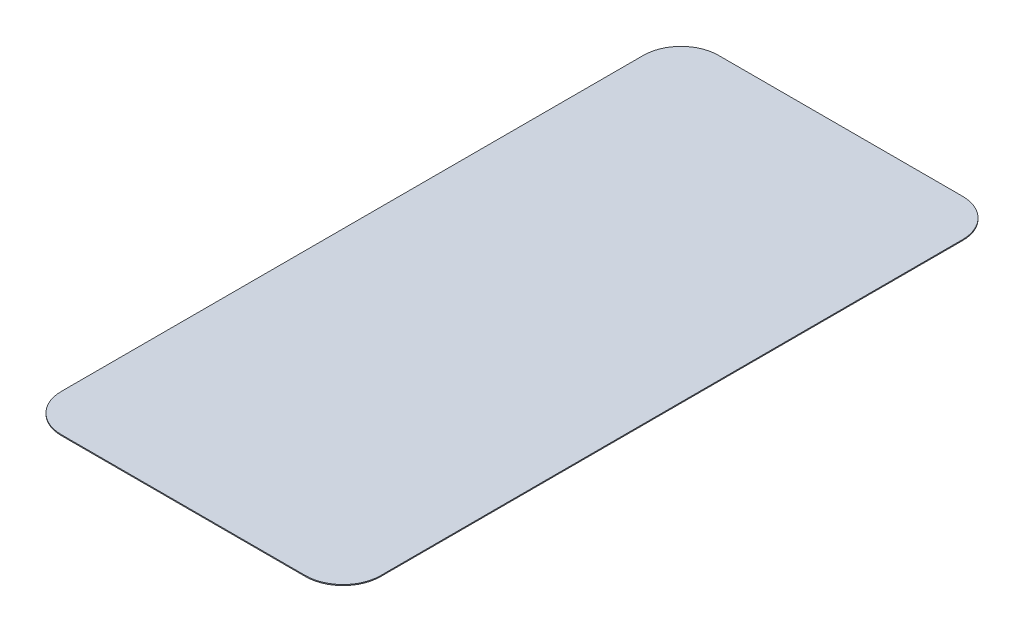
ISO-10303-21;
HEADER;
FILE_DESCRIPTION(('STEP AP214'),'2;1');
FILE_NAME('part.step','',(''),(''),'','','');
FILE_SCHEMA(('AUTOMOTIVE_DESIGN { 1 0 10303 214 1 1 1 1 }'));
ENDSEC;
DATA;
#1=APPLICATION_CONTEXT('core data for automotive mechanical design processes');
#2=APPLICATION_PROTOCOL_DEFINITION('international standard','automotive_design',2000,#1);
#3=PRODUCT_CONTEXT('',#1,'mechanical');
#4=PRODUCT('Part','Part','',(#3));
#5=PRODUCT_RELATED_PRODUCT_CATEGORY('part','',(#4));
#6=PRODUCT_DEFINITION_FORMATION('','',#4);
#7=PRODUCT_DEFINITION_CONTEXT('part definition',#1,'design');
#8=PRODUCT_DEFINITION('design','',#6,#7);
#9=PRODUCT_DEFINITION_SHAPE('','',#8);
#10=(LENGTH_UNIT() NAMED_UNIT(*) SI_UNIT(.MILLI.,.METRE.));
#11=(NAMED_UNIT(*) PLANE_ANGLE_UNIT() SI_UNIT($,.RADIAN.));
#12=(NAMED_UNIT(*) SI_UNIT($,.STERADIAN.) SOLID_ANGLE_UNIT());
#13=UNCERTAINTY_MEASURE_WITH_UNIT(LENGTH_MEASURE(1.E-05),#10,'distance_accuracy_value','');
#14=(GEOMETRIC_REPRESENTATION_CONTEXT(3) GLOBAL_UNCERTAINTY_ASSIGNED_CONTEXT((#13)) GLOBAL_UNIT_ASSIGNED_CONTEXT((#10,
#11,#12)) REPRESENTATION_CONTEXT('',''));
#15=CARTESIAN_POINT('',(0.,0.,0.));
#16=DIRECTION('',(0.,0.,1.));
#17=DIRECTION('',(1.,0.,0.));
#18=AXIS2_PLACEMENT_3D('',#15,#16,#17);
#19=CARTESIAN_POINT('',(65.,0.5,155.));
#20=DIRECTION('',(0.,-1.,0.));
#21=DIRECTION('',(0.,0.,-1.));
#22=AXIS2_PLACEMENT_3D('',#19,#20,#21);
#23=CYLINDRICAL_SURFACE('',#22,20.);
#24=CARTESIAN_POINT('',(65.,0.,155.));
#25=DIRECTION('',(0.,1.,0.));
#26=DIRECTION('',(0.,0.,-1.));
#27=AXIS2_PLACEMENT_3D('',#24,#25,#26);
#28=CIRCLE('',#27,20.);
#29=CARTESIAN_POINT('',(65.,0.,175.));
#30=VERTEX_POINT('',#29);
#31=CARTESIAN_POINT('',(85.,0.,155.));
#32=VERTEX_POINT('',#31);
#33=EDGE_CURVE('E131',#30,#32,#28,.T.);
#34=ORIENTED_EDGE('',*,*,#33,.T.);
#35=DIRECTION('',(0.,-1.,0.));
#36=VECTOR('',#35,1.);
#37=CARTESIAN_POINT('',(85.,0.5,155.));
#38=LINE('',#37,#36);
#39=CARTESIAN_POINT('',(85.,0.5,155.));
#40=VERTEX_POINT('',#39);
#41=EDGE_CURVE('E11',#40,#32,#38,.T.);
#42=ORIENTED_EDGE('',*,*,#41,.F.);
#43=CARTESIAN_POINT('',(65.,0.5,155.));
#44=DIRECTION('',(0.,1.,0.));
#45=DIRECTION('',(0.,0.,-1.));
#46=AXIS2_PLACEMENT_3D('',#43,#44,#45);
#47=CIRCLE('',#46,20.);
#48=CARTESIAN_POINT('',(65.,0.5,175.));
#49=VERTEX_POINT('',#48);
#50=EDGE_CURVE('E145',#49,#40,#47,.T.);
#51=ORIENTED_EDGE('',*,*,#50,.F.);
#52=DIRECTION('',(0.,-1.,0.));
#53=VECTOR('',#52,1.);
#54=CARTESIAN_POINT('',(65.,0.5,175.));
#55=LINE('',#54,#53);
#56=EDGE_CURVE('E127',#49,#30,#55,.T.);
#57=ORIENTED_EDGE('',*,*,#56,.T.);
#58=EDGE_LOOP('',(#34,#42,#51,#57));
#59=FACE_BOUND('',#58,.T.);
#60=ADVANCED_FACE('F35',(#59),#23,.T.);
#61=CARTESIAN_POINT('',(85.,0.5,-155.));
#62=DIRECTION('',(-1.,0.,0.));
#63=DIRECTION('',(0.,0.,1.));
#64=AXIS2_PLACEMENT_3D('',#61,#62,#63);
#65=PLANE('',#64);
#66=DIRECTION('',(0.,0.,-1.));
#67=VECTOR('',#66,1.);
#68=CARTESIAN_POINT('',(85.,0.,-155.));
#69=LINE('',#68,#67);
#70=CARTESIAN_POINT('',(85.,0.,-155.));
#71=VERTEX_POINT('',#70);
#72=EDGE_CURVE('E134',#32,#71,#69,.T.);
#73=ORIENTED_EDGE('',*,*,#72,.T.);
#74=DIRECTION('',(0.,-1.,0.));
#75=VECTOR('',#74,1.);
#76=CARTESIAN_POINT('',(85.,0.5,-155.));
#77=LINE('',#76,#75);
#78=CARTESIAN_POINT('',(85.,0.5,-155.));
#79=VERTEX_POINT('',#78);
#80=EDGE_CURVE('E43',#79,#71,#77,.T.);
#81=ORIENTED_EDGE('',*,*,#80,.F.);
#82=DIRECTION('',(0.,0.,-1.));
#83=VECTOR('',#82,1.);
#84=CARTESIAN_POINT('',(85.,0.5,-155.));
#85=LINE('',#84,#83);
#86=EDGE_CURVE('E94',#40,#79,#85,.T.);
#87=ORIENTED_EDGE('',*,*,#86,.F.);
#88=ORIENTED_EDGE('',*,*,#41,.T.);
#89=EDGE_LOOP('',(#73,#81,#87,#88));
#90=FACE_BOUND('',#89,.T.);
#91=ADVANCED_FACE('F180',(#90),#65,.F.);
#92=CARTESIAN_POINT('',(65.,0.5,-155.));
#93=DIRECTION('',(0.,-1.,0.));
#94=DIRECTION('',(0.,0.,-1.));
#95=AXIS2_PLACEMENT_3D('',#92,#93,#94);
#96=CYLINDRICAL_SURFACE('',#95,20.);
#97=CARTESIAN_POINT('',(65.,0.,-155.));
#98=DIRECTION('',(0.,1.,0.));
#99=DIRECTION('',(0.,0.,1.));
#100=AXIS2_PLACEMENT_3D('',#97,#98,#99);
#101=CIRCLE('',#100,20.);
#102=CARTESIAN_POINT('',(65.,0.,-175.));
#103=VERTEX_POINT('',#102);
#104=EDGE_CURVE('E136',#71,#103,#101,.T.);
#105=ORIENTED_EDGE('',*,*,#104,.T.);
#106=DIRECTION('',(0.,-1.,0.));
#107=VECTOR('',#106,1.);
#108=CARTESIAN_POINT('',(65.,0.5,-175.));
#109=LINE('',#108,#107);
#110=CARTESIAN_POINT('',(65.,0.5,-175.));
#111=VERTEX_POINT('',#110);
#112=EDGE_CURVE('E152',#111,#103,#109,.T.);
#113=ORIENTED_EDGE('',*,*,#112,.F.);
#114=CARTESIAN_POINT('',(65.,0.5,-155.));
#115=DIRECTION('',(0.,1.,0.));
#116=DIRECTION('',(0.,0.,1.));
#117=AXIS2_PLACEMENT_3D('',#114,#115,#116);
#118=CIRCLE('',#117,20.);
#119=EDGE_CURVE('E160',#79,#111,#118,.T.);
#120=ORIENTED_EDGE('',*,*,#119,.F.);
#121=ORIENTED_EDGE('',*,*,#80,.T.);
#122=EDGE_LOOP('',(#105,#113,#120,#121));
#123=FACE_BOUND('',#122,.T.);
#124=ADVANCED_FACE('F158',(#123),#96,.T.);
#125=CARTESIAN_POINT('',(-65.,0.5,-175.));
#126=DIRECTION('',(0.,0.,1.));
#127=DIRECTION('',(1.,0.,0.));
#128=AXIS2_PLACEMENT_3D('',#125,#126,#127);
#129=PLANE('',#128);
#130=DIRECTION('',(-1.,0.,0.));
#131=VECTOR('',#130,1.);
#132=CARTESIAN_POINT('',(-65.,0.,-175.));
#133=LINE('',#132,#131);
#134=CARTESIAN_POINT('',(-65.,0.,-175.));
#135=VERTEX_POINT('',#134);
#136=EDGE_CURVE('E138',#103,#135,#133,.T.);
#137=ORIENTED_EDGE('',*,*,#136,.T.);
#138=DIRECTION('',(0.,-1.,0.));
#139=VECTOR('',#138,1.);
#140=CARTESIAN_POINT('',(-65.,0.5,-175.));
#141=LINE('',#140,#139);
#142=CARTESIAN_POINT('',(-65.,0.5,-175.));
#143=VERTEX_POINT('',#142);
#144=EDGE_CURVE('E149',#143,#135,#141,.T.);
#145=ORIENTED_EDGE('',*,*,#144,.F.);
#146=DIRECTION('',(-1.,0.,0.));
#147=VECTOR('',#146,1.);
#148=CARTESIAN_POINT('',(-65.,0.5,-175.));
#149=LINE('',#148,#147);
#150=EDGE_CURVE('E172',#111,#143,#149,.T.);
#151=ORIENTED_EDGE('',*,*,#150,.F.);
#152=ORIENTED_EDGE('',*,*,#112,.T.);
#153=EDGE_LOOP('',(#137,#145,#151,#152));
#154=FACE_BOUND('',#153,.T.);
#155=ADVANCED_FACE('F168',(#154),#129,.F.);
#156=CARTESIAN_POINT('',(-65.,0.5,-155.));
#157=DIRECTION('',(0.,-1.,0.));
#158=DIRECTION('',(0.,0.,-1.));
#159=AXIS2_PLACEMENT_3D('',#156,#157,#158);
#160=CYLINDRICAL_SURFACE('',#159,20.);
#161=CARTESIAN_POINT('',(-65.,0.,-155.));
#162=DIRECTION('',(0.,1.,0.));
#163=DIRECTION('',(0.,0.,-1.));
#164=AXIS2_PLACEMENT_3D('',#161,#162,#163);
#165=CIRCLE('',#164,20.);
#166=CARTESIAN_POINT('',(-85.,0.,-155.));
#167=VERTEX_POINT('',#166);
#168=EDGE_CURVE('E140',#135,#167,#165,.T.);
#169=ORIENTED_EDGE('',*,*,#168,.T.);
#170=DIRECTION('',(0.,-1.,0.));
#171=VECTOR('',#170,1.);
#172=CARTESIAN_POINT('',(-85.,0.5,-155.));
#173=LINE('',#172,#171);
#174=CARTESIAN_POINT('',(-85.,0.5,-155.));
#175=VERTEX_POINT('',#174);
#176=EDGE_CURVE('E122',#175,#167,#173,.T.);
#177=ORIENTED_EDGE('',*,*,#176,.F.);
#178=CARTESIAN_POINT('',(-65.,0.5,-155.));
#179=DIRECTION('',(0.,1.,0.));
#180=DIRECTION('',(0.,0.,-1.));
#181=AXIS2_PLACEMENT_3D('',#178,#179,#180);
#182=CIRCLE('',#181,20.);
#183=EDGE_CURVE('E113',#143,#175,#182,.T.);
#184=ORIENTED_EDGE('',*,*,#183,.F.);
#185=ORIENTED_EDGE('',*,*,#144,.T.);
#186=EDGE_LOOP('',(#169,#177,#184,#185));
#187=FACE_BOUND('',#186,.T.);
#188=ADVANCED_FACE('F171',(#187),#160,.T.);
#189=CARTESIAN_POINT('',(-85.,0.5,-155.));
#190=DIRECTION('',(1.,0.,0.));
#191=DIRECTION('',(0.,0.,-1.));
#192=AXIS2_PLACEMENT_3D('',#189,#190,#191);
#193=PLANE('',#192);
#194=DIRECTION('',(0.,0.,1.));
#195=VECTOR('',#194,1.);
#196=CARTESIAN_POINT('',(-85.,0.,-155.));
#197=LINE('',#196,#195);
#198=CARTESIAN_POINT('',(-85.,0.,155.));
#199=VERTEX_POINT('',#198);
#200=EDGE_CURVE('E121',#167,#199,#197,.T.);
#201=ORIENTED_EDGE('',*,*,#200,.T.);
#202=DIRECTION('',(0.,-1.,0.));
#203=VECTOR('',#202,1.);
#204=CARTESIAN_POINT('',(-85.,0.5,155.));
#205=LINE('',#204,#203);
#206=CARTESIAN_POINT('',(-85.,0.5,155.));
#207=VERTEX_POINT('',#206);
#208=EDGE_CURVE('E118',#207,#199,#205,.T.);
#209=ORIENTED_EDGE('',*,*,#208,.F.);
#210=DIRECTION('',(0.,0.,1.));
#211=VECTOR('',#210,1.);
#212=CARTESIAN_POINT('',(-85.,0.5,-155.));
#213=LINE('',#212,#211);
#214=EDGE_CURVE('E107',#175,#207,#213,.T.);
#215=ORIENTED_EDGE('',*,*,#214,.F.);
#216=ORIENTED_EDGE('',*,*,#176,.T.);
#217=EDGE_LOOP('',(#201,#209,#215,#216));
#218=FACE_BOUND('',#217,.T.);
#219=ADVANCED_FACE('F119',(#218),#193,.F.);
#220=CARTESIAN_POINT('',(-65.,0.5,155.));
#221=DIRECTION('',(0.,-1.,0.));
#222=DIRECTION('',(0.,0.,-1.));
#223=AXIS2_PLACEMENT_3D('',#220,#221,#222);
#224=CYLINDRICAL_SURFACE('',#223,20.);
#225=CARTESIAN_POINT('',(-65.,0.,155.));
#226=DIRECTION('',(0.,1.,0.));
#227=DIRECTION('',(0.,0.,-1.));
#228=AXIS2_PLACEMENT_3D('',#225,#226,#227);
#229=CIRCLE('',#228,20.);
#230=CARTESIAN_POINT('',(-65.,0.,175.));
#231=VERTEX_POINT('',#230);
#232=EDGE_CURVE('E80',#199,#231,#229,.T.);
#233=ORIENTED_EDGE('',*,*,#232,.T.);
#234=DIRECTION('',(0.,-1.,0.));
#235=VECTOR('',#234,1.);
#236=CARTESIAN_POINT('',(-65.,0.5,175.));
#237=LINE('',#236,#235);
#238=CARTESIAN_POINT('',(-65.,0.5,175.));
#239=VERTEX_POINT('',#238);
#240=EDGE_CURVE('E123',#239,#231,#237,.T.);
#241=ORIENTED_EDGE('',*,*,#240,.F.);
#242=CARTESIAN_POINT('',(-65.,0.5,155.));
#243=DIRECTION('',(0.,1.,0.));
#244=DIRECTION('',(0.,0.,-1.));
#245=AXIS2_PLACEMENT_3D('',#242,#243,#244);
#246=CIRCLE('',#245,20.);
#247=EDGE_CURVE('E111',#207,#239,#246,.T.);
#248=ORIENTED_EDGE('',*,*,#247,.F.);
#249=ORIENTED_EDGE('',*,*,#208,.T.);
#250=EDGE_LOOP('',(#233,#241,#248,#249));
#251=FACE_BOUND('',#250,.T.);
#252=ADVANCED_FACE('F125',(#251),#224,.T.);
#253=CARTESIAN_POINT('',(-65.,0.5,175.));
#254=DIRECTION('',(0.,0.,-1.));
#255=DIRECTION('',(-1.,0.,0.));
#256=AXIS2_PLACEMENT_3D('',#253,#254,#255);
#257=PLANE('',#256);
#258=DIRECTION('',(1.,0.,0.));
#259=VECTOR('',#258,1.);
#260=CARTESIAN_POINT('',(-65.,0.,175.));
#261=LINE('',#260,#259);
#262=EDGE_CURVE('E86',#231,#30,#261,.T.);
#263=ORIENTED_EDGE('',*,*,#262,.T.);
#264=ORIENTED_EDGE('',*,*,#56,.F.);
#265=DIRECTION('',(1.,0.,0.));
#266=VECTOR('',#265,1.);
#267=CARTESIAN_POINT('',(-65.,0.5,175.));
#268=LINE('',#267,#266);
#269=EDGE_CURVE('E51',#239,#49,#268,.T.);
#270=ORIENTED_EDGE('',*,*,#269,.F.);
#271=ORIENTED_EDGE('',*,*,#240,.T.);
#272=EDGE_LOOP('',(#263,#264,#270,#271));
#273=FACE_BOUND('',#272,.T.);
#274=ADVANCED_FACE('F196',(#273),#257,.F.);
#275=CARTESIAN_POINT('',(65.,0.5,155.));
#276=DIRECTION('',(0.,-1.,0.));
#277=DIRECTION('',(0.,0.,-1.));
#278=AXIS2_PLACEMENT_3D('',#275,#276,#277);
#279=PLANE('',#278);
#280=ORIENTED_EDGE('',*,*,#50,.T.);
#281=ORIENTED_EDGE('',*,*,#86,.T.);
#282=ORIENTED_EDGE('',*,*,#119,.T.);
#283=ORIENTED_EDGE('',*,*,#150,.T.);
#284=ORIENTED_EDGE('',*,*,#183,.T.);
#285=ORIENTED_EDGE('',*,*,#214,.T.);
#286=ORIENTED_EDGE('',*,*,#247,.T.);
#287=ORIENTED_EDGE('',*,*,#269,.T.);
#288=EDGE_LOOP('',(#280,#281,#282,#283,#284,#285,#286,#287));
#289=FACE_BOUND('',#288,.T.);
#290=ADVANCED_FACE('F109',(#289),#279,.F.);
#291=CARTESIAN_POINT('',(65.,0.,155.));
#292=DIRECTION('',(0.,-1.,0.));
#293=DIRECTION('',(0.,0.,-1.));
#294=AXIS2_PLACEMENT_3D('',#291,#292,#293);
#295=PLANE('',#294);
#296=ORIENTED_EDGE('',*,*,#33,.F.);
#297=ORIENTED_EDGE('',*,*,#262,.F.);
#298=ORIENTED_EDGE('',*,*,#232,.F.);
#299=ORIENTED_EDGE('',*,*,#200,.F.);
#300=ORIENTED_EDGE('',*,*,#168,.F.);
#301=ORIENTED_EDGE('',*,*,#136,.F.);
#302=ORIENTED_EDGE('',*,*,#104,.F.);
#303=ORIENTED_EDGE('',*,*,#72,.F.);
#304=EDGE_LOOP('',(#296,#297,#298,#299,#300,#301,#302,#303));
#305=FACE_BOUND('',#304,.T.);
#306=ADVANCED_FACE('F164',(#305),#295,.T.);
#307=CLOSED_SHELL('',(#60,#91,#124,#155,#188,#219,#252,#274,#290,#306));
#308=MANIFOLD_SOLID_BREP('B2',#307);
#309=ADVANCED_BREP_SHAPE_REPRESENTATION('',(#18,#308),#14);
#310=SHAPE_DEFINITION_REPRESENTATION(#9,#309);
ENDSEC;
END-ISO-10303-21;
